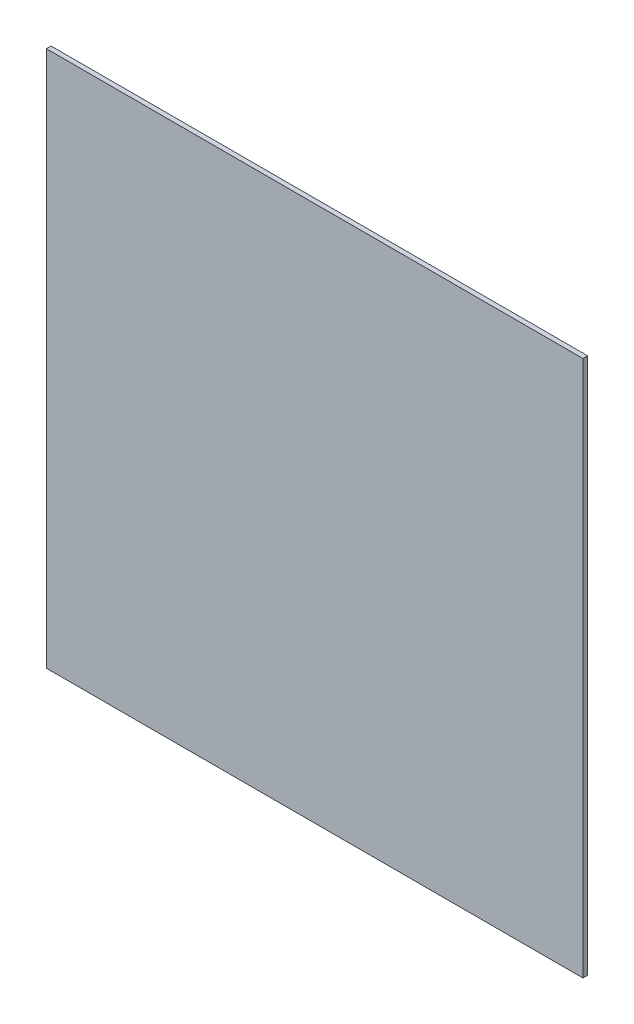
ISO-10303-21;
HEADER;
FILE_DESCRIPTION(('STEP AP214'),'2;1');
FILE_NAME('part.step','',(''),(''),'','','');
FILE_SCHEMA(('AUTOMOTIVE_DESIGN { 1 0 10303 214 1 1 1 1 }'));
ENDSEC;
DATA;
#1=APPLICATION_CONTEXT('core data for automotive mechanical design processes');
#2=APPLICATION_PROTOCOL_DEFINITION('international standard','automotive_design',2000,#1);
#3=PRODUCT_CONTEXT('',#1,'mechanical');
#4=PRODUCT('Part','Part','',(#3));
#5=PRODUCT_RELATED_PRODUCT_CATEGORY('part','',(#4));
#6=PRODUCT_DEFINITION_FORMATION('','',#4);
#7=PRODUCT_DEFINITION_CONTEXT('part definition',#1,'design');
#8=PRODUCT_DEFINITION('design','',#6,#7);
#9=PRODUCT_DEFINITION_SHAPE('','',#8);
#10=(LENGTH_UNIT() NAMED_UNIT(*) SI_UNIT(.MILLI.,.METRE.));
#11=(NAMED_UNIT(*) PLANE_ANGLE_UNIT() SI_UNIT($,.RADIAN.));
#12=(NAMED_UNIT(*) SI_UNIT($,.STERADIAN.) SOLID_ANGLE_UNIT());
#13=UNCERTAINTY_MEASURE_WITH_UNIT(LENGTH_MEASURE(1.E-05),#10,'distance_accuracy_value','');
#14=(GEOMETRIC_REPRESENTATION_CONTEXT(3) GLOBAL_UNCERTAINTY_ASSIGNED_CONTEXT((#13)) GLOBAL_UNIT_ASSIGNED_CONTEXT((#10,
#11,#12)) REPRESENTATION_CONTEXT('',''));
#15=CARTESIAN_POINT('',(0.,0.,0.));
#16=DIRECTION('',(0.,0.,1.));
#17=DIRECTION('',(1.,0.,0.));
#18=AXIS2_PLACEMENT_3D('',#15,#16,#17);
#19=CARTESIAN_POINT('',(68.65,-68.65,1.2));
#20=DIRECTION('',(-1.,0.,0.));
#21=DIRECTION('',(0.,0.,1.));
#22=AXIS2_PLACEMENT_3D('',#19,#20,#21);
#23=PLANE('',#22);
#24=DIRECTION('',(0.,1.,0.));
#25=VECTOR('',#24,1.);
#26=CARTESIAN_POINT('',(68.65,-68.65,0.));
#27=LINE('',#26,#25);
#28=CARTESIAN_POINT('',(68.65,-68.65,0.));
#29=VERTEX_POINT('',#28);
#30=CARTESIAN_POINT('',(68.65,68.65,0.));
#31=VERTEX_POINT('',#30);
#32=EDGE_CURVE('E102',#29,#31,#27,.T.);
#33=ORIENTED_EDGE('',*,*,#32,.T.);
#34=DIRECTION('',(0.,0.,-1.));
#35=VECTOR('',#34,1.);
#36=CARTESIAN_POINT('',(68.65,68.65,1.2));
#37=LINE('',#36,#35);
#38=CARTESIAN_POINT('',(68.65,68.65,1.2));
#39=VERTEX_POINT('',#38);
#40=EDGE_CURVE('E11',#39,#31,#37,.T.);
#41=ORIENTED_EDGE('',*,*,#40,.F.);
#42=DIRECTION('',(0.,1.,0.));
#43=VECTOR('',#42,1.);
#44=CARTESIAN_POINT('',(68.65,-68.65,1.2));
#45=LINE('',#44,#43);
#46=CARTESIAN_POINT('',(68.65,-68.65,1.2));
#47=VERTEX_POINT('',#46);
#48=EDGE_CURVE('E90',#47,#39,#45,.T.);
#49=ORIENTED_EDGE('',*,*,#48,.F.);
#50=DIRECTION('',(0.,0.,-1.));
#51=VECTOR('',#50,1.);
#52=CARTESIAN_POINT('',(68.65,-68.65,1.2));
#53=LINE('',#52,#51);
#54=EDGE_CURVE('E98',#47,#29,#53,.T.);
#55=ORIENTED_EDGE('',*,*,#54,.T.);
#56=EDGE_LOOP('',(#33,#41,#49,#55));
#57=FACE_BOUND('',#56,.T.);
#58=ADVANCED_FACE('F39',(#57),#23,.F.);
#59=CARTESIAN_POINT('',(-68.65,68.65,1.2));
#60=DIRECTION('',(0.,-1.,0.));
#61=DIRECTION('',(0.,0.,-1.));
#62=AXIS2_PLACEMENT_3D('',#59,#60,#61);
#63=PLANE('',#62);
#64=DIRECTION('',(-1.,0.,0.));
#65=VECTOR('',#64,1.);
#66=CARTESIAN_POINT('',(-68.65,68.65,0.));
#67=LINE('',#66,#65);
#68=CARTESIAN_POINT('',(-68.65,68.65,0.));
#69=VERTEX_POINT('',#68);
#70=EDGE_CURVE('E94',#31,#69,#67,.T.);
#71=ORIENTED_EDGE('',*,*,#70,.T.);
#72=DIRECTION('',(0.,0.,-1.));
#73=VECTOR('',#72,1.);
#74=CARTESIAN_POINT('',(-68.65,68.65,1.2));
#75=LINE('',#74,#73);
#76=CARTESIAN_POINT('',(-68.65,68.65,1.2));
#77=VERTEX_POINT('',#76);
#78=EDGE_CURVE('E47',#77,#69,#75,.T.);
#79=ORIENTED_EDGE('',*,*,#78,.F.);
#80=DIRECTION('',(-1.,0.,0.));
#81=VECTOR('',#80,1.);
#82=CARTESIAN_POINT('',(-68.65,68.65,1.2));
#83=LINE('',#82,#81);
#84=EDGE_CURVE('E85',#39,#77,#83,.T.);
#85=ORIENTED_EDGE('',*,*,#84,.F.);
#86=ORIENTED_EDGE('',*,*,#40,.T.);
#87=EDGE_LOOP('',(#71,#79,#85,#86));
#88=FACE_BOUND('',#87,.T.);
#89=ADVANCED_FACE('F93',(#88),#63,.F.);
#90=CARTESIAN_POINT('',(-68.65,-68.65,1.2));
#91=DIRECTION('',(1.,0.,0.));
#92=DIRECTION('',(0.,0.,-1.));
#93=AXIS2_PLACEMENT_3D('',#90,#91,#92);
#94=PLANE('',#93);
#95=DIRECTION('',(0.,-1.,0.));
#96=VECTOR('',#95,1.);
#97=CARTESIAN_POINT('',(-68.65,-68.65,0.));
#98=LINE('',#97,#96);
#99=CARTESIAN_POINT('',(-68.65,-68.65,0.));
#100=VERTEX_POINT('',#99);
#101=EDGE_CURVE('E72',#69,#100,#98,.T.);
#102=ORIENTED_EDGE('',*,*,#101,.T.);
#103=DIRECTION('',(0.,0.,-1.));
#104=VECTOR('',#103,1.);
#105=CARTESIAN_POINT('',(-68.65,-68.65,1.2));
#106=LINE('',#105,#104);
#107=CARTESIAN_POINT('',(-68.65,-68.65,1.2));
#108=VERTEX_POINT('',#107);
#109=EDGE_CURVE('E95',#108,#100,#106,.T.);
#110=ORIENTED_EDGE('',*,*,#109,.F.);
#111=DIRECTION('',(0.,-1.,0.));
#112=VECTOR('',#111,1.);
#113=CARTESIAN_POINT('',(-68.65,-68.65,1.2));
#114=LINE('',#113,#112);
#115=EDGE_CURVE('E88',#77,#108,#114,.T.);
#116=ORIENTED_EDGE('',*,*,#115,.F.);
#117=ORIENTED_EDGE('',*,*,#78,.T.);
#118=EDGE_LOOP('',(#102,#110,#116,#117));
#119=FACE_BOUND('',#118,.T.);
#120=ADVANCED_FACE('F96',(#119),#94,.F.);
#121=CARTESIAN_POINT('',(-68.65,-68.65,1.2));
#122=DIRECTION('',(0.,1.,0.));
#123=DIRECTION('',(0.,0.,1.));
#124=AXIS2_PLACEMENT_3D('',#121,#122,#123);
#125=PLANE('',#124);
#126=DIRECTION('',(1.,0.,0.));
#127=VECTOR('',#126,1.);
#128=CARTESIAN_POINT('',(-68.65,-68.65,0.));
#129=LINE('',#128,#127);
#130=EDGE_CURVE('E78',#100,#29,#129,.T.);
#131=ORIENTED_EDGE('',*,*,#130,.T.);
#132=ORIENTED_EDGE('',*,*,#54,.F.);
#133=DIRECTION('',(1.,0.,0.));
#134=VECTOR('',#133,1.);
#135=CARTESIAN_POINT('',(-68.65,-68.65,1.2));
#136=LINE('',#135,#134);
#137=EDGE_CURVE('E55',#108,#47,#136,.T.);
#138=ORIENTED_EDGE('',*,*,#137,.F.);
#139=ORIENTED_EDGE('',*,*,#109,.T.);
#140=EDGE_LOOP('',(#131,#132,#138,#139));
#141=FACE_BOUND('',#140,.T.);
#142=ADVANCED_FACE('F109',(#141),#125,.F.);
#143=CARTESIAN_POINT('',(0.,0.,1.2));
#144=DIRECTION('',(0.,0.,-1.));
#145=DIRECTION('',(-1.,0.,0.));
#146=AXIS2_PLACEMENT_3D('',#143,#144,#145);
#147=PLANE('',#146);
#148=ORIENTED_EDGE('',*,*,#48,.T.);
#149=ORIENTED_EDGE('',*,*,#84,.T.);
#150=ORIENTED_EDGE('',*,*,#115,.T.);
#151=ORIENTED_EDGE('',*,*,#137,.T.);
#152=EDGE_LOOP('',(#148,#149,#150,#151));
#153=FACE_BOUND('',#152,.T.);
#154=ADVANCED_FACE('F86',(#153),#147,.F.);
#155=CARTESIAN_POINT('',(0.,0.,0.));
#156=DIRECTION('',(0.,0.,-1.));
#157=DIRECTION('',(-1.,0.,0.));
#158=AXIS2_PLACEMENT_3D('',#155,#156,#157);
#159=PLANE('',#158);
#160=ORIENTED_EDGE('',*,*,#32,.F.);
#161=ORIENTED_EDGE('',*,*,#130,.F.);
#162=ORIENTED_EDGE('',*,*,#101,.F.);
#163=ORIENTED_EDGE('',*,*,#70,.F.);
#164=EDGE_LOOP('',(#160,#161,#162,#163));
#165=FACE_BOUND('',#164,.T.);
#166=ADVANCED_FACE('F112',(#165),#159,.T.);
#167=CLOSED_SHELL('',(#58,#89,#120,#142,#154,#166));
#168=MANIFOLD_SOLID_BREP('B2',#167);
#169=ADVANCED_BREP_SHAPE_REPRESENTATION('',(#18,#168),#14);
#170=SHAPE_DEFINITION_REPRESENTATION(#9,#169);
ENDSEC;
END-ISO-10303-21;
